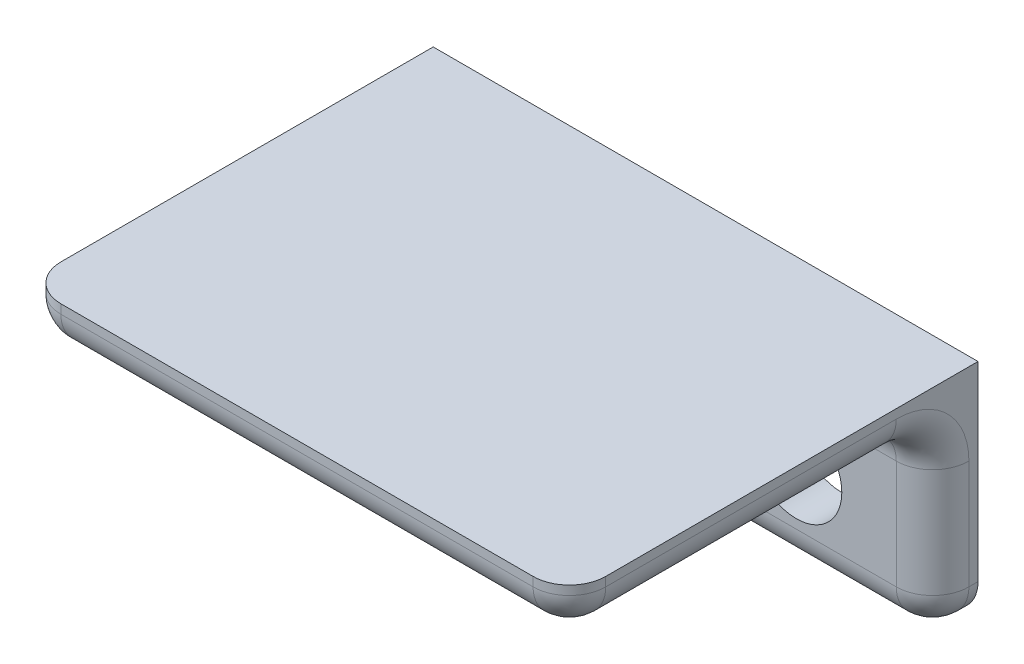
ISO-10303-21;
HEADER;
FILE_DESCRIPTION(('STEP AP214'),'2;1');
FILE_NAME('part.step','',(''),(''),'','','');
FILE_SCHEMA(('AUTOMOTIVE_DESIGN { 1 0 10303 214 1 1 1 1 }'));
ENDSEC;
DATA;
#1=APPLICATION_CONTEXT('core data for automotive mechanical design processes');
#2=APPLICATION_PROTOCOL_DEFINITION('international standard','automotive_design',2000,#1);
#3=PRODUCT_CONTEXT('',#1,'mechanical');
#4=PRODUCT('Part','Part','',(#3));
#5=PRODUCT_RELATED_PRODUCT_CATEGORY('part','',(#4));
#6=PRODUCT_DEFINITION_FORMATION('','',#4);
#7=PRODUCT_DEFINITION_CONTEXT('part definition',#1,'design');
#8=PRODUCT_DEFINITION('design','',#6,#7);
#9=PRODUCT_DEFINITION_SHAPE('','',#8);
#10=(LENGTH_UNIT() NAMED_UNIT(*) SI_UNIT(.MILLI.,.METRE.));
#11=(NAMED_UNIT(*) PLANE_ANGLE_UNIT() SI_UNIT($,.RADIAN.));
#12=(NAMED_UNIT(*) SI_UNIT($,.STERADIAN.) SOLID_ANGLE_UNIT());
#13=UNCERTAINTY_MEASURE_WITH_UNIT(LENGTH_MEASURE(1.E-05),#10,'distance_accuracy_value','');
#14=(GEOMETRIC_REPRESENTATION_CONTEXT(3) GLOBAL_UNCERTAINTY_ASSIGNED_CONTEXT((#13)) GLOBAL_UNIT_ASSIGNED_CONTEXT((#10,
#11,#12)) REPRESENTATION_CONTEXT('',''));
#15=CARTESIAN_POINT('',(0.,0.,0.));
#16=DIRECTION('',(0.,0.,1.));
#17=DIRECTION('',(1.,0.,0.));
#18=AXIS2_PLACEMENT_3D('',#15,#16,#17);
#19=CARTESIAN_POINT('',(0.,0.,2.5));
#20=DIRECTION('',(0.,0.,-1.));
#21=DIRECTION('',(-1.,0.,0.));
#22=AXIS2_PLACEMENT_3D('',#19,#20,#21);
#23=PLANE('',#22);
#24=DIRECTION('',(0.,-1.,0.));
#25=VECTOR('',#24,1.);
#26=CARTESIAN_POINT('',(28.638953423132,0.,2.5));
#27=LINE('',#26,#25);
#28=CARTESIAN_POINT('',(28.638953423132,-43.1,2.5));
#29=VERTEX_POINT('',#28);
#30=CARTESIAN_POINT('',(28.638953423132,-49.1,2.5));
#31=VERTEX_POINT('',#30);
#32=EDGE_CURVE('E227',#29,#31,#27,.T.);
#33=ORIENTED_EDGE('',*,*,#32,.T.);
#34=DIRECTION('',(1.,0.,0.));
#35=VECTOR('',#34,1.);
#36=CARTESIAN_POINT('',(0.,-49.1,2.5));
#37=LINE('',#36,#35);
#38=CARTESIAN_POINT('',(54.638953423132,-49.1,2.5));
#39=VERTEX_POINT('',#38);
#40=EDGE_CURVE('E230',#31,#39,#37,.T.);
#41=ORIENTED_EDGE('',*,*,#40,.T.);
#42=DIRECTION('',(0.,1.,0.));
#43=VECTOR('',#42,1.);
#44=CARTESIAN_POINT('',(54.638953423132,0.,2.5));
#45=LINE('',#44,#43);
#46=CARTESIAN_POINT('',(54.638953423132,-43.1,2.5));
#47=VERTEX_POINT('',#46);
#48=EDGE_CURVE('E225',#39,#47,#45,.T.);
#49=ORIENTED_EDGE('',*,*,#48,.T.);
#50=DIRECTION('',(-1.,0.,0.));
#51=VECTOR('',#50,1.);
#52=CARTESIAN_POINT('',(0.,-43.1,2.5));
#53=LINE('',#52,#51);
#54=EDGE_CURVE('E223',#47,#29,#53,.T.);
#55=ORIENTED_EDGE('',*,*,#54,.T.);
#56=EDGE_LOOP('',(#33,#41,#49,#55));
#57=FACE_BOUND('',#56,.T.);
#58=CARTESIAN_POINT('',(49.138953423132,-46.1,2.5));
#59=DIRECTION('',(0.,0.,1.));
#60=DIRECTION('',(1.,0.,0.));
#61=AXIS2_PLACEMENT_3D('',#58,#59,#60);
#62=CIRCLE('',#61,2.5);
#63=CARTESIAN_POINT('',(51.638953423132,-46.1,2.5));
#64=VERTEX_POINT('',#63);
#65=EDGE_CURVE('E185',#64,#64,#62,.T.);
#66=ORIENTED_EDGE('',*,*,#65,.F.);
#67=EDGE_LOOP('',(#66));
#68=FACE_BOUND('',#67,.T.);
#69=CARTESIAN_POINT('',(34.138953423132,-46.1,2.5));
#70=DIRECTION('',(0.,0.,1.));
#71=DIRECTION('',(-1.,0.,0.));
#72=AXIS2_PLACEMENT_3D('',#69,#70,#71);
#73=CIRCLE('',#72,2.5);
#74=CARTESIAN_POINT('',(31.638953423132,-46.1,2.5));
#75=VERTEX_POINT('',#74);
#76=EDGE_CURVE('E179',#75,#75,#73,.T.);
#77=ORIENTED_EDGE('',*,*,#76,.F.);
#78=EDGE_LOOP('',(#77));
#79=FACE_BOUND('',#78,.T.);
#80=ADVANCED_FACE('F35',(#57,#68,#79),#23,.F.);
#81=CARTESIAN_POINT('',(0.,0.,0.));
#82=DIRECTION('',(0.,0.,-1.));
#83=DIRECTION('',(-1.,0.,0.));
#84=AXIS2_PLACEMENT_3D('',#81,#82,#83);
#85=PLANE('',#84);
#86=CARTESIAN_POINT('',(49.138953423132,-46.1,0.));
#87=DIRECTION('',(0.,0.,1.));
#88=DIRECTION('',(1.,0.,0.));
#89=AXIS2_PLACEMENT_3D('',#86,#87,#88);
#90=CIRCLE('',#89,2.5);
#91=CARTESIAN_POINT('',(51.638953423132,-46.1,0.));
#92=VERTEX_POINT('',#91);
#93=EDGE_CURVE('E182',#92,#92,#90,.T.);
#94=ORIENTED_EDGE('',*,*,#93,.T.);
#95=EDGE_LOOP('',(#94));
#96=FACE_BOUND('',#95,.T.);
#97=DIRECTION('',(0.,1.,0.));
#98=VECTOR('',#97,1.);
#99=CARTESIAN_POINT('',(56.638953423132,-41.1,0.));
#100=LINE('',#99,#98);
#101=CARTESIAN_POINT('',(56.638953423132,-49.1,0.));
#102=VERTEX_POINT('',#101);
#103=CARTESIAN_POINT('',(56.638953423132,-38.6,0.));
#104=VERTEX_POINT('',#103);
#105=EDGE_CURVE('E166',#102,#104,#100,.T.);
#106=ORIENTED_EDGE('',*,*,#105,.F.);
#107=CARTESIAN_POINT('',(54.638953423132,-49.1,0.));
#108=DIRECTION('',(0.,0.,-1.));
#109=DIRECTION('',(-1.,0.,0.));
#110=AXIS2_PLACEMENT_3D('',#107,#108,#109);
#111=CIRCLE('',#110,2.);
#112=CARTESIAN_POINT('',(54.638953423132,-51.1,0.));
#113=VERTEX_POINT('',#112);
#114=EDGE_CURVE('E243',#102,#113,#111,.T.);
#115=ORIENTED_EDGE('',*,*,#114,.T.);
#116=DIRECTION('',(1.,0.,0.));
#117=VECTOR('',#116,1.);
#118=CARTESIAN_POINT('',(56.638953423132,-51.1,0.));
#119=LINE('',#118,#117);
#120=CARTESIAN_POINT('',(28.638953423132,-51.1,0.));
#121=VERTEX_POINT('',#120);
#122=EDGE_CURVE('E165',#121,#113,#119,.T.);
#123=ORIENTED_EDGE('',*,*,#122,.F.);
#124=CARTESIAN_POINT('',(28.638953423132,-49.1,0.));
#125=DIRECTION('',(0.,0.,-1.));
#126=DIRECTION('',(-1.,0.,0.));
#127=AXIS2_PLACEMENT_3D('',#124,#125,#126);
#128=CIRCLE('',#127,2.);
#129=CARTESIAN_POINT('',(26.638953423132,-49.1,0.));
#130=VERTEX_POINT('',#129);
#131=EDGE_CURVE('E164',#121,#130,#128,.T.);
#132=ORIENTED_EDGE('',*,*,#131,.T.);
#133=DIRECTION('',(0.,-1.,0.));
#134=VECTOR('',#133,1.);
#135=CARTESIAN_POINT('',(26.638953423132,-41.1,0.));
#136=LINE('',#135,#134);
#137=CARTESIAN_POINT('',(26.638953423132,-38.6,0.));
#138=VERTEX_POINT('',#137);
#139=EDGE_CURVE('E145',#138,#130,#136,.T.);
#140=ORIENTED_EDGE('',*,*,#139,.F.);
#141=DIRECTION('',(1.,0.,0.));
#142=VECTOR('',#141,1.);
#143=CARTESIAN_POINT('',(26.638953423132,-38.6,0.));
#144=LINE('',#143,#142);
#145=EDGE_CURVE('E161',#138,#104,#144,.T.);
#146=ORIENTED_EDGE('',*,*,#145,.T.);
#147=EDGE_LOOP('',(#106,#115,#123,#132,#140,#146));
#148=FACE_BOUND('',#147,.T.);
#149=CARTESIAN_POINT('',(34.138953423132,-46.1,0.));
#150=DIRECTION('',(0.,0.,1.));
#151=DIRECTION('',(-1.,0.,0.));
#152=AXIS2_PLACEMENT_3D('',#149,#150,#151);
#153=CIRCLE('',#152,2.5);
#154=CARTESIAN_POINT('',(31.638953423132,-46.1,0.));
#155=VERTEX_POINT('',#154);
#156=EDGE_CURVE('E177',#155,#155,#153,.T.);
#157=ORIENTED_EDGE('',*,*,#156,.T.);
#158=EDGE_LOOP('',(#157));
#159=FACE_BOUND('',#158,.T.);
#160=ADVANCED_FACE('F159',(#96,#148,#159),#85,.T.);
#161=CARTESIAN_POINT('',(56.638953423132,-41.1,2.5));
#162=DIRECTION('',(-1.,0.,0.));
#163=DIRECTION('',(0.,0.,1.));
#164=AXIS2_PLACEMENT_3D('',#161,#162,#163);
#165=PLANE('',#164);
#166=DIRECTION('',(0.,1.,0.));
#167=VECTOR('',#166,1.);
#168=CARTESIAN_POINT('',(56.638953423132,-41.1,0.5));
#169=LINE('',#168,#167);
#170=CARTESIAN_POINT('',(56.638953423132,-43.1,0.5));
#171=VERTEX_POINT('',#170);
#172=CARTESIAN_POINT('',(56.638953423132,-49.1,0.5));
#173=VERTEX_POINT('',#172);
#174=EDGE_CURVE('E219',#171,#173,#169,.F.);
#175=ORIENTED_EDGE('',*,*,#174,.T.);
#176=DIRECTION('',(0.,0.,-1.));
#177=VECTOR('',#176,1.);
#178=CARTESIAN_POINT('',(56.638953423132,-49.1,2.5));
#179=LINE('',#178,#177);
#180=EDGE_CURVE('E221',#173,#102,#179,.T.);
#181=ORIENTED_EDGE('',*,*,#180,.T.);
#182=ORIENTED_EDGE('',*,*,#105,.T.);
#183=DIRECTION('',(0.,0.,-1.));
#184=VECTOR('',#183,1.);
#185=CARTESIAN_POINT('',(56.638953423132,-38.6,22.5));
#186=LINE('',#185,#184);
#187=CARTESIAN_POINT('',(56.638953423132,-38.6,20.5));
#188=VERTEX_POINT('',#187);
#189=EDGE_CURVE('E153',#188,#104,#186,.T.);
#190=ORIENTED_EDGE('',*,*,#189,.F.);
#191=DIRECTION('',(0.,-1.,0.));
#192=VECTOR('',#191,1.);
#193=CARTESIAN_POINT('',(56.638953423132,-41.1,20.5));
#194=LINE('',#193,#192);
#195=CARTESIAN_POINT('',(56.638953423132,-39.1,20.5));
#196=VERTEX_POINT('',#195);
#197=EDGE_CURVE('E212',#188,#196,#194,.T.);
#198=ORIENTED_EDGE('',*,*,#197,.T.);
#199=DIRECTION('',(0.,0.,-1.));
#200=VECTOR('',#199,1.);
#201=CARTESIAN_POINT('',(56.638953423132,-39.1,2.50000000000001));
#202=LINE('',#201,#200);
#203=CARTESIAN_POINT('',(56.638953423132,-39.1,4.5));
#204=VERTEX_POINT('',#203);
#205=EDGE_CURVE('E214',#196,#204,#202,.T.);
#206=ORIENTED_EDGE('',*,*,#205,.T.);
#207=CARTESIAN_POINT('',(56.638953423132,-43.1,4.5));
#208=DIRECTION('',(-1.,0.,0.));
#209=DIRECTION('',(0.,0.,1.));
#210=AXIS2_PLACEMENT_3D('',#207,#208,#209);
#211=CIRCLE('',#210,4.);
#212=EDGE_CURVE('E216',#171,#204,#211,.F.);
#213=ORIENTED_EDGE('',*,*,#212,.F.);
#214=EDGE_LOOP('',(#175,#181,#182,#190,#198,#206,#213));
#215=FACE_BOUND('',#214,.T.);
#216=ADVANCED_FACE('F307',(#215),#165,.F.);
#217=CARTESIAN_POINT('',(26.638953423132,-41.1,2.5));
#218=DIRECTION('',(1.,0.,0.));
#219=DIRECTION('',(0.,0.,-1.));
#220=AXIS2_PLACEMENT_3D('',#217,#218,#219);
#221=PLANE('',#220);
#222=ORIENTED_EDGE('',*,*,#139,.T.);
#223=DIRECTION('',(0.,0.,-1.));
#224=VECTOR('',#223,1.);
#225=CARTESIAN_POINT('',(26.638953423132,-49.1,2.5));
#226=LINE('',#225,#224);
#227=CARTESIAN_POINT('',(26.638953423132,-49.1,0.5));
#228=VERTEX_POINT('',#227);
#229=EDGE_CURVE('E210',#130,#228,#226,.F.);
#230=ORIENTED_EDGE('',*,*,#229,.T.);
#231=DIRECTION('',(0.,-1.,0.));
#232=VECTOR('',#231,1.);
#233=CARTESIAN_POINT('',(26.638953423132,-41.1,0.5));
#234=LINE('',#233,#232);
#235=CARTESIAN_POINT('',(26.638953423132,-43.1,0.5));
#236=VERTEX_POINT('',#235);
#237=EDGE_CURVE('E208',#228,#236,#234,.F.);
#238=ORIENTED_EDGE('',*,*,#237,.T.);
#239=CARTESIAN_POINT('',(26.638953423132,-43.1,4.5));
#240=DIRECTION('',(1.,0.,0.));
#241=DIRECTION('',(0.,0.,-1.));
#242=AXIS2_PLACEMENT_3D('',#239,#240,#241);
#243=CIRCLE('',#242,4.);
#244=CARTESIAN_POINT('',(26.638953423132,-39.1,4.5));
#245=VERTEX_POINT('',#244);
#246=EDGE_CURVE('E205',#245,#236,#243,.F.);
#247=ORIENTED_EDGE('',*,*,#246,.F.);
#248=DIRECTION('',(0.,0.,-1.));
#249=VECTOR('',#248,1.);
#250=CARTESIAN_POINT('',(26.638953423132,-39.1,22.5));
#251=LINE('',#250,#249);
#252=CARTESIAN_POINT('',(26.638953423132,-39.1,20.5));
#253=VERTEX_POINT('',#252);
#254=EDGE_CURVE('E203',#245,#253,#251,.F.);
#255=ORIENTED_EDGE('',*,*,#254,.T.);
#256=DIRECTION('',(0.,1.,0.));
#257=VECTOR('',#256,1.);
#258=CARTESIAN_POINT('',(26.638953423132,-41.1,20.5));
#259=LINE('',#258,#257);
#260=CARTESIAN_POINT('',(26.638953423132,-38.6,20.5));
#261=VERTEX_POINT('',#260);
#262=EDGE_CURVE('E149',#253,#261,#259,.T.);
#263=ORIENTED_EDGE('',*,*,#262,.T.);
#264=DIRECTION('',(0.,0.,-1.));
#265=VECTOR('',#264,1.);
#266=CARTESIAN_POINT('',(26.638953423132,-38.6,22.5));
#267=LINE('',#266,#265);
#268=EDGE_CURVE('E142',#261,#138,#267,.T.);
#269=ORIENTED_EDGE('',*,*,#268,.T.);
#270=EDGE_LOOP('',(#222,#230,#238,#247,#255,#263,#269));
#271=FACE_BOUND('',#270,.T.);
#272=ADVANCED_FACE('F144',(#271),#221,.F.);
#273=CARTESIAN_POINT('',(56.638953423132,-51.1,2.5));
#274=DIRECTION('',(0.,1.,0.));
#275=DIRECTION('',(0.,0.,1.));
#276=AXIS2_PLACEMENT_3D('',#273,#274,#275);
#277=PLANE('',#276);
#278=ORIENTED_EDGE('',*,*,#122,.T.);
#279=DIRECTION('',(0.,0.,-1.));
#280=VECTOR('',#279,1.);
#281=CARTESIAN_POINT('',(54.638953423132,-51.1,2.5));
#282=LINE('',#281,#280);
#283=CARTESIAN_POINT('',(54.638953423132,-51.1,0.5));
#284=VERTEX_POINT('',#283);
#285=EDGE_CURVE('E236',#113,#284,#282,.F.);
#286=ORIENTED_EDGE('',*,*,#285,.T.);
#287=DIRECTION('',(1.,0.,0.));
#288=VECTOR('',#287,1.);
#289=CARTESIAN_POINT('',(56.638953423132,-51.1,0.5));
#290=LINE('',#289,#288);
#291=CARTESIAN_POINT('',(28.638953423132,-51.1,0.5));
#292=VERTEX_POINT('',#291);
#293=EDGE_CURVE('E234',#284,#292,#290,.F.);
#294=ORIENTED_EDGE('',*,*,#293,.T.);
#295=DIRECTION('',(0.,0.,-1.));
#296=VECTOR('',#295,1.);
#297=CARTESIAN_POINT('',(28.638953423132,-51.1,2.5));
#298=LINE('',#297,#296);
#299=EDGE_CURVE('E232',#292,#121,#298,.T.);
#300=ORIENTED_EDGE('',*,*,#299,.T.);
#301=EDGE_LOOP('',(#278,#286,#294,#300));
#302=FACE_BOUND('',#301,.T.);
#303=ADVANCED_FACE('F309',(#302),#277,.F.);
#304=CARTESIAN_POINT('',(49.138953423132,-46.1,2.5));
#305=DIRECTION('',(0.,0.,-1.));
#306=DIRECTION('',(-1.,0.,0.));
#307=AXIS2_PLACEMENT_3D('',#304,#305,#306);
#308=CYLINDRICAL_SURFACE('',#307,2.5);
#309=ORIENTED_EDGE('',*,*,#65,.T.);
#310=EDGE_LOOP('',(#309));
#311=FACE_BOUND('',#310,.T.);
#312=ORIENTED_EDGE('',*,*,#93,.F.);
#313=EDGE_LOOP('',(#312));
#314=FACE_BOUND('',#313,.T.);
#315=ADVANCED_FACE('F379',(#311,#314),#308,.F.);
#316=CARTESIAN_POINT('',(34.138953423132,-46.1,2.5));
#317=DIRECTION('',(0.,0.,-1.));
#318=DIRECTION('',(-1.,0.,0.));
#319=AXIS2_PLACEMENT_3D('',#316,#317,#318);
#320=CYLINDRICAL_SURFACE('',#319,2.5);
#321=ORIENTED_EDGE('',*,*,#76,.T.);
#322=EDGE_LOOP('',(#321));
#323=FACE_BOUND('',#322,.T.);
#324=ORIENTED_EDGE('',*,*,#156,.F.);
#325=EDGE_LOOP('',(#324));
#326=FACE_BOUND('',#325,.T.);
#327=ADVANCED_FACE('F376',(#323,#326),#320,.F.);
#328=CARTESIAN_POINT('',(26.638953423132,-41.1,22.5));
#329=DIRECTION('',(0.,-1.,0.));
#330=DIRECTION('',(1.,0.,0.));
#331=AXIS2_PLACEMENT_3D('',#328,#329,#330);
#332=PLANE('',#331);
#333=DIRECTION('',(0.,0.,-1.));
#334=VECTOR('',#333,1.);
#335=CARTESIAN_POINT('',(54.638953423132,-41.1,22.5));
#336=LINE('',#335,#334);
#337=CARTESIAN_POINT('',(54.638953423132,-41.1,4.5));
#338=VERTEX_POINT('',#337);
#339=CARTESIAN_POINT('',(54.638953423132,-41.1,20.5));
#340=VERTEX_POINT('',#339);
#341=EDGE_CURVE('E195',#338,#340,#336,.F.);
#342=ORIENTED_EDGE('',*,*,#341,.T.);
#343=DIRECTION('',(-1.,0.,0.));
#344=VECTOR('',#343,1.);
#345=CARTESIAN_POINT('',(26.638953423132,-41.1,20.5));
#346=LINE('',#345,#344);
#347=CARTESIAN_POINT('',(28.638953423132,-41.1,20.5));
#348=VERTEX_POINT('',#347);
#349=EDGE_CURVE('E200',#340,#348,#346,.T.);
#350=ORIENTED_EDGE('',*,*,#349,.T.);
#351=DIRECTION('',(0.,0.,-1.));
#352=VECTOR('',#351,1.);
#353=CARTESIAN_POINT('',(28.638953423132,-41.1,2.5));
#354=LINE('',#353,#352);
#355=CARTESIAN_POINT('',(28.638953423132,-41.1,4.5));
#356=VERTEX_POINT('',#355);
#357=EDGE_CURVE('E197',#348,#356,#354,.T.);
#358=ORIENTED_EDGE('',*,*,#357,.T.);
#359=DIRECTION('',(-1.,0.,0.));
#360=VECTOR('',#359,1.);
#361=CARTESIAN_POINT('',(26.638953423132,-41.1,4.5));
#362=LINE('',#361,#360);
#363=EDGE_CURVE('E193',#356,#338,#362,.F.);
#364=ORIENTED_EDGE('',*,*,#363,.T.);
#365=EDGE_LOOP('',(#342,#350,#358,#364));
#366=FACE_BOUND('',#365,.T.);
#367=ADVANCED_FACE('F342',(#366),#332,.T.);
#368=CARTESIAN_POINT('',(26.638953423132,-38.6,22.5));
#369=DIRECTION('',(0.,1.,0.));
#370=DIRECTION('',(-1.,0.,0.));
#371=AXIS2_PLACEMENT_3D('',#368,#369,#370);
#372=PLANE('',#371);
#373=DIRECTION('',(1.,0.,0.));
#374=VECTOR('',#373,1.);
#375=CARTESIAN_POINT('',(26.638953423132,-38.6,22.5));
#376=LINE('',#375,#374);
#377=CARTESIAN_POINT('',(28.638953423132,-38.6,22.5));
#378=VERTEX_POINT('',#377);
#379=CARTESIAN_POINT('',(54.638953423132,-38.6,22.5));
#380=VERTEX_POINT('',#379);
#381=EDGE_CURVE('E154',#378,#380,#376,.T.);
#382=ORIENTED_EDGE('',*,*,#381,.T.);
#383=CARTESIAN_POINT('',(54.638953423132,-38.6,20.5));
#384=DIRECTION('',(0.,1.,0.));
#385=DIRECTION('',(-1.,0.,0.));
#386=AXIS2_PLACEMENT_3D('',#383,#384,#385);
#387=CIRCLE('',#386,2.);
#388=EDGE_CURVE('E11',#380,#188,#387,.T.);
#389=ORIENTED_EDGE('',*,*,#388,.T.);
#390=ORIENTED_EDGE('',*,*,#189,.T.);
#391=ORIENTED_EDGE('',*,*,#145,.F.);
#392=ORIENTED_EDGE('',*,*,#268,.F.);
#393=CARTESIAN_POINT('',(28.638953423132,-38.6,20.5));
#394=DIRECTION('',(0.,1.,0.));
#395=DIRECTION('',(-1.,0.,0.));
#396=AXIS2_PLACEMENT_3D('',#393,#394,#395);
#397=CIRCLE('',#396,2.);
#398=EDGE_CURVE('E44',#261,#378,#397,.T.);
#399=ORIENTED_EDGE('',*,*,#398,.T.);
#400=EDGE_LOOP('',(#382,#389,#390,#391,#392,#399));
#401=FACE_BOUND('',#400,.T.);
#402=ADVANCED_FACE('F169',(#401),#372,.T.);
#403=CARTESIAN_POINT('',(0.,0.,22.5));
#404=DIRECTION('',(0.,0.,-1.));
#405=DIRECTION('',(-1.,0.,0.));
#406=AXIS2_PLACEMENT_3D('',#403,#404,#405);
#407=PLANE('',#406);
#408=DIRECTION('',(-1.,0.,0.));
#409=VECTOR('',#408,1.);
#410=CARTESIAN_POINT('',(56.638953423132,-39.1,22.5));
#411=LINE('',#410,#409);
#412=CARTESIAN_POINT('',(28.638953423132,-39.1,22.5));
#413=VERTEX_POINT('',#412);
#414=CARTESIAN_POINT('',(54.638953423132,-39.1,22.5));
#415=VERTEX_POINT('',#414);
#416=EDGE_CURVE('E52',#413,#415,#411,.F.);
#417=ORIENTED_EDGE('',*,*,#416,.T.);
#418=DIRECTION('',(0.,-1.,0.));
#419=VECTOR('',#418,1.);
#420=CARTESIAN_POINT('',(54.638953423132,0.,22.5));
#421=LINE('',#420,#419);
#422=EDGE_CURVE('E240',#415,#380,#421,.F.);
#423=ORIENTED_EDGE('',*,*,#422,.T.);
#424=ORIENTED_EDGE('',*,*,#381,.F.);
#425=DIRECTION('',(0.,1.,0.));
#426=VECTOR('',#425,1.);
#427=CARTESIAN_POINT('',(28.638953423132,0.,22.5));
#428=LINE('',#427,#426);
#429=EDGE_CURVE('E57',#378,#413,#428,.F.);
#430=ORIENTED_EDGE('',*,*,#429,.T.);
#431=EDGE_LOOP('',(#417,#423,#424,#430));
#432=FACE_BOUND('',#431,.T.);
#433=ADVANCED_FACE('F354',(#432),#407,.F.);
#434=CARTESIAN_POINT('',(54.638953423132,-49.1,2.5));
#435=DIRECTION('',(0.,0.,-1.));
#436=DIRECTION('',(-1.,0.,0.));
#437=AXIS2_PLACEMENT_3D('',#434,#435,#436);
#438=CYLINDRICAL_SURFACE('',#437,2.);
#439=CARTESIAN_POINT('',(54.638953423132,-49.1,0.5));
#440=DIRECTION('',(0.,0.,1.));
#441=DIRECTION('',(1.,0.,0.));
#442=AXIS2_PLACEMENT_3D('',#439,#440,#441);
#443=CIRCLE('',#442,2.);
#444=EDGE_CURVE('E39',#284,#173,#443,.T.);
#445=ORIENTED_EDGE('',*,*,#444,.F.);
#446=ORIENTED_EDGE('',*,*,#285,.F.);
#447=ORIENTED_EDGE('',*,*,#114,.F.);
#448=ORIENTED_EDGE('',*,*,#180,.F.);
#449=EDGE_LOOP('',(#445,#446,#447,#448));
#450=FACE_BOUND('',#449,.T.);
#451=ADVANCED_FACE('F37',(#450),#438,.T.);
#452=CARTESIAN_POINT('',(54.638953423132,-49.1,0.5));
#453=DIRECTION('',(0.,0.,1.));
#454=DIRECTION('',(1.,0.,0.));
#455=AXIS2_PLACEMENT_3D('',#452,#453,#454);
#456=SPHERICAL_SURFACE('',#455,2.);
#457=CARTESIAN_POINT('',(54.638953423132,-49.1,0.5));
#458=DIRECTION('',(1.,0.,0.));
#459=DIRECTION('',(0.,0.,-1.));
#460=AXIS2_PLACEMENT_3D('',#457,#458,#459);
#461=CIRCLE('',#460,2.);
#462=EDGE_CURVE('E288',#284,#39,#461,.F.);
#463=ORIENTED_EDGE('',*,*,#462,.F.);
#464=ORIENTED_EDGE('',*,*,#444,.T.);
#465=CARTESIAN_POINT('',(54.638953423132,-49.1,0.5));
#466=DIRECTION('',(0.,-1.,0.));
#467=DIRECTION('',(0.,0.,-1.));
#468=AXIS2_PLACEMENT_3D('',#465,#466,#467);
#469=CIRCLE('',#468,2.);
#470=EDGE_CURVE('E175',#39,#173,#469,.F.);
#471=ORIENTED_EDGE('',*,*,#470,.F.);
#472=EDGE_LOOP('',(#463,#464,#471));
#473=FACE_BOUND('',#472,.T.);
#474=ADVANCED_FACE('F299',(#473),#456,.T.);
#475=CARTESIAN_POINT('',(54.638953423132,-41.1,20.5));
#476=DIRECTION('',(0.,-1.,0.));
#477=DIRECTION('',(0.,0.,-1.));
#478=AXIS2_PLACEMENT_3D('',#475,#476,#477);
#479=CYLINDRICAL_SURFACE('',#478,2.);
#480=ORIENTED_EDGE('',*,*,#388,.F.);
#481=ORIENTED_EDGE('',*,*,#422,.F.);
#482=CARTESIAN_POINT('',(54.638953423132,-39.1,20.5));
#483=DIRECTION('',(0.,-1.,0.));
#484=DIRECTION('',(0.,0.,-1.));
#485=AXIS2_PLACEMENT_3D('',#482,#483,#484);
#486=CIRCLE('',#485,2.);
#487=EDGE_CURVE('E285',#196,#415,#486,.T.);
#488=ORIENTED_EDGE('',*,*,#487,.F.);
#489=ORIENTED_EDGE('',*,*,#197,.F.);
#490=EDGE_LOOP('',(#480,#481,#488,#489));
#491=FACE_BOUND('',#490,.T.);
#492=ADVANCED_FACE('F357',(#491),#479,.T.);
#493=CARTESIAN_POINT('',(54.638953423132,-39.1,2.5));
#494=DIRECTION('',(0.,0.,1.));
#495=DIRECTION('',(1.,0.,0.));
#496=AXIS2_PLACEMENT_3D('',#493,#494,#495);
#497=CYLINDRICAL_SURFACE('',#496,2.);
#498=CARTESIAN_POINT('',(54.638953423132,-39.1,4.5));
#499=DIRECTION('',(0.,0.,-1.));
#500=DIRECTION('',(-1.,0.,0.));
#501=AXIS2_PLACEMENT_3D('',#498,#499,#500);
#502=CIRCLE('',#501,2.);
#503=EDGE_CURVE('E279',#204,#338,#502,.T.);
#504=ORIENTED_EDGE('',*,*,#503,.F.);
#505=ORIENTED_EDGE('',*,*,#205,.F.);
#506=CARTESIAN_POINT('',(54.638953423132,-39.1,20.5));
#507=DIRECTION('',(0.,0.,1.));
#508=DIRECTION('',(1.,0.,0.));
#509=AXIS2_PLACEMENT_3D('',#506,#507,#508);
#510=CIRCLE('',#509,2.);
#511=EDGE_CURVE('E282',#340,#196,#510,.T.);
#512=ORIENTED_EDGE('',*,*,#511,.F.);
#513=ORIENTED_EDGE('',*,*,#341,.F.);
#514=EDGE_LOOP('',(#504,#505,#512,#513));
#515=FACE_BOUND('',#514,.T.);
#516=ADVANCED_FACE('F365',(#515),#497,.T.);
#517=CARTESIAN_POINT('',(54.638953423132,0.,0.5));
#518=DIRECTION('',(0.,1.,0.));
#519=DIRECTION('',(0.,0.,1.));
#520=AXIS2_PLACEMENT_3D('',#517,#518,#519);
#521=CYLINDRICAL_SURFACE('',#520,2.);
#522=ORIENTED_EDGE('',*,*,#470,.T.);
#523=ORIENTED_EDGE('',*,*,#174,.F.);
#524=CARTESIAN_POINT('',(54.638953423132,-43.1,0.5));
#525=DIRECTION('',(0.,1.,0.));
#526=DIRECTION('',(0.,0.,1.));
#527=AXIS2_PLACEMENT_3D('',#524,#525,#526);
#528=CIRCLE('',#527,2.);
#529=EDGE_CURVE('E276',#47,#171,#528,.T.);
#530=ORIENTED_EDGE('',*,*,#529,.F.);
#531=ORIENTED_EDGE('',*,*,#48,.F.);
#532=EDGE_LOOP('',(#522,#523,#530,#531));
#533=FACE_BOUND('',#532,.T.);
#534=ADVANCED_FACE('F295',(#533),#521,.T.);
#535=CARTESIAN_POINT('',(0.,-49.1,0.5));
#536=DIRECTION('',(1.,0.,0.));
#537=DIRECTION('',(0.,0.,-1.));
#538=AXIS2_PLACEMENT_3D('',#535,#536,#537);
#539=CYLINDRICAL_SURFACE('',#538,2.);
#540=ORIENTED_EDGE('',*,*,#462,.T.);
#541=ORIENTED_EDGE('',*,*,#40,.F.);
#542=CARTESIAN_POINT('',(28.638953423132,-49.1,0.5));
#543=DIRECTION('',(-1.,0.,0.));
#544=DIRECTION('',(0.,0.,1.));
#545=AXIS2_PLACEMENT_3D('',#542,#543,#544);
#546=CIRCLE('',#545,2.);
#547=EDGE_CURVE('E273',#292,#31,#546,.T.);
#548=ORIENTED_EDGE('',*,*,#547,.F.);
#549=ORIENTED_EDGE('',*,*,#293,.F.);
#550=EDGE_LOOP('',(#540,#541,#548,#549));
#551=FACE_BOUND('',#550,.T.);
#552=ADVANCED_FACE('F318',(#551),#539,.T.);
#553=CARTESIAN_POINT('',(28.638953423132,-49.1,2.5));
#554=DIRECTION('',(0.,0.,-1.));
#555=DIRECTION('',(-1.,0.,0.));
#556=AXIS2_PLACEMENT_3D('',#553,#554,#555);
#557=CYLINDRICAL_SURFACE('',#556,2.);
#558=ORIENTED_EDGE('',*,*,#131,.F.);
#559=ORIENTED_EDGE('',*,*,#299,.F.);
#560=CARTESIAN_POINT('',(28.638953423132,-49.1,0.5));
#561=DIRECTION('',(0.,0.,1.));
#562=DIRECTION('',(1.,0.,0.));
#563=AXIS2_PLACEMENT_3D('',#560,#561,#562);
#564=CIRCLE('',#563,2.);
#565=EDGE_CURVE('E270',#228,#292,#564,.T.);
#566=ORIENTED_EDGE('',*,*,#565,.F.);
#567=ORIENTED_EDGE('',*,*,#229,.F.);
#568=EDGE_LOOP('',(#558,#559,#566,#567));
#569=FACE_BOUND('',#568,.T.);
#570=ADVANCED_FACE('F314',(#569),#557,.T.);
#571=CARTESIAN_POINT('',(54.638953423132,-39.1,20.5));
#572=DIRECTION('',(0.,0.,1.));
#573=DIRECTION('',(1.,0.,0.));
#574=AXIS2_PLACEMENT_3D('',#571,#572,#573);
#575=SPHERICAL_SURFACE('',#574,2.);
#576=ORIENTED_EDGE('',*,*,#511,.T.);
#577=ORIENTED_EDGE('',*,*,#487,.T.);
#578=CARTESIAN_POINT('',(54.638953423132,-39.1,20.5));
#579=DIRECTION('',(1.,0.,0.));
#580=DIRECTION('',(0.,0.,-1.));
#581=AXIS2_PLACEMENT_3D('',#578,#579,#580);
#582=CIRCLE('',#581,2.);
#583=EDGE_CURVE('E267',#340,#415,#582,.F.);
#584=ORIENTED_EDGE('',*,*,#583,.F.);
#585=EDGE_LOOP('',(#576,#577,#584));
#586=FACE_BOUND('',#585,.T.);
#587=ADVANCED_FACE('F361',(#586),#575,.T.);
#588=CARTESIAN_POINT('',(54.638953423132,-43.1,4.5));
#589=DIRECTION('',(-1.,0.,0.));
#590=DIRECTION('',(0.,0.,1.));
#591=AXIS2_PLACEMENT_3D('',#588,#589,#590);
#592=TOROIDAL_SURFACE('',#591,4.,2.);
#593=ORIENTED_EDGE('',*,*,#212,.T.);
#594=ORIENTED_EDGE('',*,*,#503,.T.);
#595=CARTESIAN_POINT('',(54.638953423132,-43.1,4.5));
#596=DIRECTION('',(-1.,0.,0.));
#597=DIRECTION('',(0.,0.,1.));
#598=AXIS2_PLACEMENT_3D('',#595,#596,#597);
#599=CIRCLE('',#598,2.);
#600=EDGE_CURVE('E264',#47,#338,#599,.F.);
#601=ORIENTED_EDGE('',*,*,#600,.F.);
#602=ORIENTED_EDGE('',*,*,#529,.T.);
#603=EDGE_LOOP('',(#593,#594,#601,#602));
#604=FACE_BOUND('',#603,.T.);
#605=ADVANCED_FACE('F367',(#604),#592,.T.);
#606=CARTESIAN_POINT('',(28.638953423132,-49.1,0.5));
#607=DIRECTION('',(0.,0.,1.));
#608=DIRECTION('',(1.,0.,0.));
#609=AXIS2_PLACEMENT_3D('',#606,#607,#608);
#610=SPHERICAL_SURFACE('',#609,2.);
#611=ORIENTED_EDGE('',*,*,#565,.T.);
#612=ORIENTED_EDGE('',*,*,#547,.T.);
#613=CARTESIAN_POINT('',(28.638953423132,-49.1,0.5));
#614=DIRECTION('',(0.,-1.,0.));
#615=DIRECTION('',(0.,0.,-1.));
#616=AXIS2_PLACEMENT_3D('',#613,#614,#615);
#617=CIRCLE('',#616,2.);
#618=EDGE_CURVE('E262',#228,#31,#617,.F.);
#619=ORIENTED_EDGE('',*,*,#618,.F.);
#620=EDGE_LOOP('',(#611,#612,#619));
#621=FACE_BOUND('',#620,.T.);
#622=ADVANCED_FACE('F320',(#621),#610,.T.);
#623=CARTESIAN_POINT('',(28.638953423132,-41.1,20.5));
#624=DIRECTION('',(0.,1.,0.));
#625=DIRECTION('',(0.,0.,1.));
#626=AXIS2_PLACEMENT_3D('',#623,#624,#625);
#627=CYLINDRICAL_SURFACE('',#626,2.);
#628=ORIENTED_EDGE('',*,*,#398,.F.);
#629=ORIENTED_EDGE('',*,*,#262,.F.);
#630=CARTESIAN_POINT('',(28.638953423132,-39.1,20.5));
#631=DIRECTION('',(0.,-1.,0.));
#632=DIRECTION('',(0.,0.,-1.));
#633=AXIS2_PLACEMENT_3D('',#630,#631,#632);
#634=CIRCLE('',#633,2.);
#635=EDGE_CURVE('E259',#413,#253,#634,.T.);
#636=ORIENTED_EDGE('',*,*,#635,.F.);
#637=ORIENTED_EDGE('',*,*,#429,.F.);
#638=EDGE_LOOP('',(#628,#629,#636,#637));
#639=FACE_BOUND('',#638,.T.);
#640=ADVANCED_FACE('F352',(#639),#627,.T.);
#641=CARTESIAN_POINT('',(26.638953423132,-39.1,20.5));
#642=DIRECTION('',(1.,0.,0.));
#643=DIRECTION('',(0.,1.,0.));
#644=AXIS2_PLACEMENT_3D('',#641,#642,#643);
#645=CYLINDRICAL_SURFACE('',#644,2.);
#646=ORIENTED_EDGE('',*,*,#583,.T.);
#647=ORIENTED_EDGE('',*,*,#416,.F.);
#648=CARTESIAN_POINT('',(28.638953423132,-39.1,20.5));
#649=DIRECTION('',(-1.,0.,0.));
#650=DIRECTION('',(0.,0.,1.));
#651=AXIS2_PLACEMENT_3D('',#648,#649,#650);
#652=CIRCLE('',#651,2.);
#653=EDGE_CURVE('E256',#348,#413,#652,.T.);
#654=ORIENTED_EDGE('',*,*,#653,.F.);
#655=ORIENTED_EDGE('',*,*,#349,.F.);
#656=EDGE_LOOP('',(#646,#647,#654,#655));
#657=FACE_BOUND('',#656,.T.);
#658=ADVANCED_FACE('F347',(#657),#645,.T.);
#659=CARTESIAN_POINT('',(0.,-43.1,4.5));
#660=DIRECTION('',(-1.,0.,0.));
#661=DIRECTION('',(0.,-1.,0.));
#662=AXIS2_PLACEMENT_3D('',#659,#660,#661);
#663=CYLINDRICAL_SURFACE('',#662,2.);
#664=ORIENTED_EDGE('',*,*,#600,.T.);
#665=ORIENTED_EDGE('',*,*,#363,.F.);
#666=CARTESIAN_POINT('',(28.638953423132,-43.1,4.5));
#667=DIRECTION('',(1.,0.,0.));
#668=DIRECTION('',(0.,0.,-1.));
#669=AXIS2_PLACEMENT_3D('',#666,#667,#668);
#670=CIRCLE('',#669,2.);
#671=EDGE_CURVE('E253',#29,#356,#670,.T.);
#672=ORIENTED_EDGE('',*,*,#671,.F.);
#673=ORIENTED_EDGE('',*,*,#54,.F.);
#674=EDGE_LOOP('',(#664,#665,#672,#673));
#675=FACE_BOUND('',#674,.T.);
#676=ADVANCED_FACE('F338',(#675),#663,.F.);
#677=CARTESIAN_POINT('',(28.638953423132,0.,0.5));
#678=DIRECTION('',(0.,-1.,0.));
#679=DIRECTION('',(0.,0.,-1.));
#680=AXIS2_PLACEMENT_3D('',#677,#678,#679);
#681=CYLINDRICAL_SURFACE('',#680,2.);
#682=ORIENTED_EDGE('',*,*,#618,.T.);
#683=ORIENTED_EDGE('',*,*,#32,.F.);
#684=CARTESIAN_POINT('',(28.638953423132,-43.1,0.5));
#685=DIRECTION('',(0.,1.,0.));
#686=DIRECTION('',(0.,0.,1.));
#687=AXIS2_PLACEMENT_3D('',#684,#685,#686);
#688=CIRCLE('',#687,2.);
#689=EDGE_CURVE('E250',#236,#29,#688,.T.);
#690=ORIENTED_EDGE('',*,*,#689,.F.);
#691=ORIENTED_EDGE('',*,*,#237,.F.);
#692=EDGE_LOOP('',(#682,#683,#690,#691));
#693=FACE_BOUND('',#692,.T.);
#694=ADVANCED_FACE('F325',(#693),#681,.T.);
#695=CARTESIAN_POINT('',(28.638953423132,-39.1,20.5));
#696=DIRECTION('',(0.,0.,1.));
#697=DIRECTION('',(1.,0.,0.));
#698=AXIS2_PLACEMENT_3D('',#695,#696,#697);
#699=SPHERICAL_SURFACE('',#698,2.);
#700=ORIENTED_EDGE('',*,*,#653,.T.);
#701=ORIENTED_EDGE('',*,*,#635,.T.);
#702=CARTESIAN_POINT('',(28.638953423132,-39.1,20.5));
#703=DIRECTION('',(0.,0.,1.));
#704=DIRECTION('',(1.,0.,0.));
#705=AXIS2_PLACEMENT_3D('',#702,#703,#704);
#706=CIRCLE('',#705,2.);
#707=EDGE_CURVE('E248',#348,#253,#706,.F.);
#708=ORIENTED_EDGE('',*,*,#707,.F.);
#709=EDGE_LOOP('',(#700,#701,#708));
#710=FACE_BOUND('',#709,.T.);
#711=ADVANCED_FACE('F350',(#710),#699,.T.);
#712=CARTESIAN_POINT('',(28.638953423132,-43.1,4.5));
#713=DIRECTION('',(1.,0.,0.));
#714=DIRECTION('',(0.,0.,-1.));
#715=AXIS2_PLACEMENT_3D('',#712,#713,#714);
#716=TOROIDAL_SURFACE('',#715,4.,2.);
#717=ORIENTED_EDGE('',*,*,#689,.T.);
#718=ORIENTED_EDGE('',*,*,#671,.T.);
#719=CARTESIAN_POINT('',(28.638953423132,-39.1,4.5));
#720=DIRECTION('',(0.,0.,-1.));
#721=DIRECTION('',(-1.,0.,0.));
#722=AXIS2_PLACEMENT_3D('',#719,#720,#721);
#723=CIRCLE('',#722,2.);
#724=EDGE_CURVE('E246',#245,#356,#723,.F.);
#725=ORIENTED_EDGE('',*,*,#724,.F.);
#726=ORIENTED_EDGE('',*,*,#246,.T.);
#727=EDGE_LOOP('',(#717,#718,#725,#726));
#728=FACE_BOUND('',#727,.T.);
#729=ADVANCED_FACE('F333',(#728),#716,.T.);
#730=CARTESIAN_POINT('',(28.638953423132,-39.1,22.5));
#731=DIRECTION('',(0.,0.,1.));
#732=DIRECTION('',(1.,0.,0.));
#733=AXIS2_PLACEMENT_3D('',#730,#731,#732);
#734=CYLINDRICAL_SURFACE('',#733,2.);
#735=ORIENTED_EDGE('',*,*,#707,.T.);
#736=ORIENTED_EDGE('',*,*,#254,.F.);
#737=ORIENTED_EDGE('',*,*,#724,.T.);
#738=ORIENTED_EDGE('',*,*,#357,.F.);
#739=EDGE_LOOP('',(#735,#736,#737,#738));
#740=FACE_BOUND('',#739,.T.);
#741=ADVANCED_FACE('F330',(#740),#734,.T.);
#742=CLOSED_SHELL('',(#80,#160,#216,#272,#303,#315,#327,#367,#402,#433,#451,#474,#492,#516,#534,
#552,#570,#587,#605,#622,#640,#658,#676,#694,#711,#729,#741));
#743=MANIFOLD_SOLID_BREP('B2',#742);
#744=ADVANCED_BREP_SHAPE_REPRESENTATION('',(#18,#743),#14);
#745=SHAPE_DEFINITION_REPRESENTATION(#9,#744);
ENDSEC;
END-ISO-10303-21;
